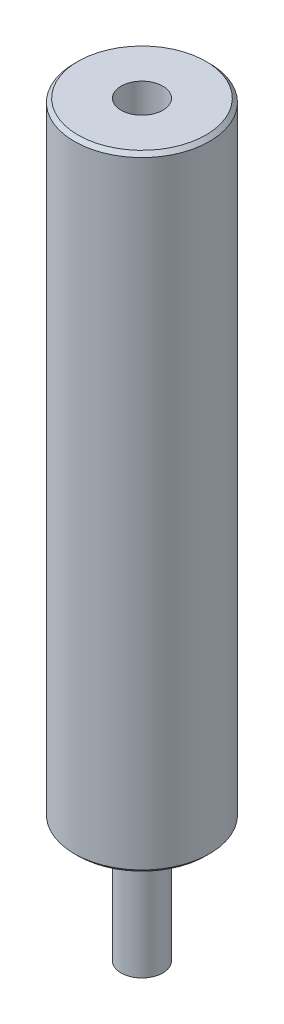
ISO-10303-21;
HEADER;
FILE_DESCRIPTION(('STEP AP214'),'2;1');
FILE_NAME('part.step','',(''),(''),'','','');
FILE_SCHEMA(('AUTOMOTIVE_DESIGN { 1 0 10303 214 1 1 1 1 }'));
ENDSEC;
DATA;
#1=APPLICATION_CONTEXT('core data for automotive mechanical design processes');
#2=APPLICATION_PROTOCOL_DEFINITION('international standard','automotive_design',2000,#1);
#3=PRODUCT_CONTEXT('',#1,'mechanical');
#4=PRODUCT('Part','Part','',(#3));
#5=PRODUCT_RELATED_PRODUCT_CATEGORY('part','',(#4));
#6=PRODUCT_DEFINITION_FORMATION('','',#4);
#7=PRODUCT_DEFINITION_CONTEXT('part definition',#1,'design');
#8=PRODUCT_DEFINITION('design','',#6,#7);
#9=PRODUCT_DEFINITION_SHAPE('','',#8);
#10=(LENGTH_UNIT() NAMED_UNIT(*) SI_UNIT(.MILLI.,.METRE.));
#11=(NAMED_UNIT(*) PLANE_ANGLE_UNIT() SI_UNIT($,.RADIAN.));
#12=(NAMED_UNIT(*) SI_UNIT($,.STERADIAN.) SOLID_ANGLE_UNIT());
#13=UNCERTAINTY_MEASURE_WITH_UNIT(LENGTH_MEASURE(1.E-05),#10,'distance_accuracy_value','');
#14=(GEOMETRIC_REPRESENTATION_CONTEXT(3) GLOBAL_UNCERTAINTY_ASSIGNED_CONTEXT((#13)) GLOBAL_UNIT_ASSIGNED_CONTEXT((#10,
#11,#12)) REPRESENTATION_CONTEXT('',''));
#15=CARTESIAN_POINT('',(0.,0.,0.));
#16=DIRECTION('',(0.,0.,1.));
#17=DIRECTION('',(1.,0.,0.));
#18=AXIS2_PLACEMENT_3D('',#15,#16,#17);
#19=CARTESIAN_POINT('',(-5.5896611928906E-12,-6.03498774064352E-11,0.));
#20=DIRECTION('',(0.,1.,0.));
#21=DIRECTION('',(0.,0.,1.));
#22=AXIS2_PLACEMENT_3D('',#19,#20,#21);
#23=CYLINDRICAL_SURFACE('',#22,1.7);
#24=CARTESIAN_POINT('',(-5.5896611928906E-12,-6.03498774064352E-11,0.));
#25=DIRECTION('',(0.,1.,0.));
#26=DIRECTION('',(0.,0.,1.));
#27=AXIS2_PLACEMENT_3D('',#24,#25,#26);
#28=CIRCLE('',#27,1.7);
#29=CARTESIAN_POINT('',(-5.5896611928906E-12,-6.03498774064352E-11,1.7));
#30=VERTEX_POINT('',#29);
#31=EDGE_CURVE('E62',#30,#30,#28,.T.);
#32=ORIENTED_EDGE('',*,*,#31,.T.);
#33=EDGE_LOOP('',(#32));
#34=FACE_BOUND('',#33,.T.);
#35=CARTESIAN_POINT('',(-5.5896611928906E-12,9.49999999993965,0.));
#36=DIRECTION('',(0.,1.,0.));
#37=DIRECTION('',(0.,0.,1.));
#38=AXIS2_PLACEMENT_3D('',#35,#36,#37);
#39=CIRCLE('',#38,1.7);
#40=CARTESIAN_POINT('',(-5.5896611928906E-12,9.49999999993965,1.7));
#41=VERTEX_POINT('',#40);
#42=EDGE_CURVE('E10',#41,#41,#39,.T.);
#43=ORIENTED_EDGE('',*,*,#42,.F.);
#44=EDGE_LOOP('',(#43));
#45=FACE_BOUND('',#44,.T.);
#46=ADVANCED_FACE('F31',(#34,#45),#23,.T.);
#47=CARTESIAN_POINT('',(-5.58971272046627E-12,9.49999999993965,0.));
#48=DIRECTION('',(0.,1.,0.));
#49=DIRECTION('',(0.,0.,1.));
#50=AXIS2_PLACEMENT_3D('',#47,#48,#49);
#51=TOROIDAL_SURFACE('',#50,2.2,0.500000000000001);
#52=ORIENTED_EDGE('',*,*,#42,.T.);
#53=EDGE_LOOP('',(#52));
#54=FACE_BOUND('',#53,.T.);
#55=CARTESIAN_POINT('',(-5.5896611928906E-12,9.99999999993965,0.));
#56=DIRECTION('',(0.,1.,0.));
#57=DIRECTION('',(0.,0.,1.));
#58=AXIS2_PLACEMENT_3D('',#55,#56,#57);
#59=CIRCLE('',#58,2.2);
#60=CARTESIAN_POINT('',(-5.5896611928906E-12,9.99999999993965,2.2));
#61=VERTEX_POINT('',#60);
#62=EDGE_CURVE('E37',#61,#61,#59,.T.);
#63=ORIENTED_EDGE('',*,*,#62,.F.);
#64=EDGE_LOOP('',(#63));
#65=FACE_BOUND('',#64,.T.);
#66=ADVANCED_FACE('F79',(#54,#65),#51,.F.);
#67=CARTESIAN_POINT('',(5.19999999993965,9.99999999993965,0.));
#68=DIRECTION('',(0.,-1.,0.));
#69=DIRECTION('',(0.,0.,-1.));
#70=AXIS2_PLACEMENT_3D('',#67,#68,#69);
#71=PLANE('',#70);
#72=ORIENTED_EDGE('',*,*,#62,.T.);
#73=EDGE_LOOP('',(#72));
#74=FACE_BOUND('',#73,.T.);
#75=CARTESIAN_POINT('',(-5.5896611928906E-12,9.99999999993965,0.));
#76=DIRECTION('',(0.,1.,0.));
#77=DIRECTION('',(0.,0.,1.));
#78=AXIS2_PLACEMENT_3D('',#75,#76,#77);
#79=CIRCLE('',#78,5.19999999994524);
#80=CARTESIAN_POINT('',(-5.5896611928906E-12,9.99999999993965,5.19999999994524));
#81=VERTEX_POINT('',#80);
#82=EDGE_CURVE('E41',#81,#81,#79,.T.);
#83=ORIENTED_EDGE('',*,*,#82,.F.);
#84=EDGE_LOOP('',(#83));
#85=FACE_BOUND('',#84,.T.);
#86=ADVANCED_FACE('F83',(#74,#85),#71,.T.);
#87=CARTESIAN_POINT('',(-5.5896611928906E-12,10.3,0.));
#88=DIRECTION('',(0.,1.,0.));
#89=DIRECTION('',(0.,0.,1.));
#90=AXIS2_PLACEMENT_3D('',#87,#88,#89);
#91=CONICAL_SURFACE('',#90,5.50000000000559,0.785398163397448);
#92=ORIENTED_EDGE('',*,*,#82,.T.);
#93=EDGE_LOOP('',(#92));
#94=FACE_BOUND('',#93,.T.);
#95=CARTESIAN_POINT('',(-5.5896611928906E-12,10.3,0.));
#96=DIRECTION('',(0.,1.,0.));
#97=DIRECTION('',(0.,0.,1.));
#98=AXIS2_PLACEMENT_3D('',#95,#96,#97);
#99=CIRCLE('',#98,5.50000000000559);
#100=CARTESIAN_POINT('',(-5.5896611928906E-12,10.3,5.50000000000559));
#101=VERTEX_POINT('',#100);
#102=EDGE_CURVE('E45',#101,#101,#99,.T.);
#103=ORIENTED_EDGE('',*,*,#102,.F.);
#104=EDGE_LOOP('',(#103));
#105=FACE_BOUND('',#104,.T.);
#106=ADVANCED_FACE('F87',(#94,#105),#91,.T.);
#107=CARTESIAN_POINT('',(-5.5896611928906E-12,-6.03498774064352E-11,0.));
#108=DIRECTION('',(0.,1.,0.));
#109=DIRECTION('',(0.,0.,1.));
#110=AXIS2_PLACEMENT_3D('',#107,#108,#109);
#111=CYLINDRICAL_SURFACE('',#110,5.50000000000559);
#112=ORIENTED_EDGE('',*,*,#102,.T.);
#113=EDGE_LOOP('',(#112));
#114=FACE_BOUND('',#113,.T.);
#115=CARTESIAN_POINT('',(-5.5896611928906E-12,60.5,0.));
#116=DIRECTION('',(0.,1.,0.));
#117=DIRECTION('',(0.,0.,1.));
#118=AXIS2_PLACEMENT_3D('',#115,#116,#117);
#119=CIRCLE('',#118,5.50000000000559);
#120=CARTESIAN_POINT('',(-5.5896611928906E-12,60.5,5.50000000000559));
#121=VERTEX_POINT('',#120);
#122=EDGE_CURVE('E50',#121,#121,#119,.T.);
#123=ORIENTED_EDGE('',*,*,#122,.F.);
#124=EDGE_LOOP('',(#123));
#125=FACE_BOUND('',#124,.T.);
#126=ADVANCED_FACE('F93',(#114,#125),#111,.T.);
#127=CARTESIAN_POINT('',(-5.5896611928906E-12,60.8000000000418,0.));
#128=DIRECTION('',(0.,-1.,0.));
#129=DIRECTION('',(0.,0.,-1.));
#130=AXIS2_PLACEMENT_3D('',#127,#128,#129);
#131=CONICAL_SURFACE('',#130,5.19999999996379,0.785398163397441);
#132=ORIENTED_EDGE('',*,*,#122,.T.);
#133=EDGE_LOOP('',(#132));
#134=FACE_BOUND('',#133,.T.);
#135=CARTESIAN_POINT('',(-5.5896611928906E-12,60.8000000000418,0.));
#136=DIRECTION('',(0.,1.,0.));
#137=DIRECTION('',(0.,0.,1.));
#138=AXIS2_PLACEMENT_3D('',#135,#136,#137);
#139=CIRCLE('',#138,5.19999999996379);
#140=CARTESIAN_POINT('',(-5.5896611928906E-12,60.8000000000418,5.19999999996379));
#141=VERTEX_POINT('',#140);
#142=EDGE_CURVE('E53',#141,#141,#139,.T.);
#143=ORIENTED_EDGE('',*,*,#142,.F.);
#144=EDGE_LOOP('',(#143));
#145=FACE_BOUND('',#144,.T.);
#146=ADVANCED_FACE('F97',(#134,#145),#131,.T.);
#147=CARTESIAN_POINT('',(1.69999999999442,60.8000000000418,0.));
#148=DIRECTION('',(0.,1.,0.));
#149=DIRECTION('',(0.,0.,1.));
#150=AXIS2_PLACEMENT_3D('',#147,#148,#149);
#151=PLANE('',#150);
#152=ORIENTED_EDGE('',*,*,#142,.T.);
#153=EDGE_LOOP('',(#152));
#154=FACE_BOUND('',#153,.T.);
#155=CARTESIAN_POINT('',(-5.5896611928906E-12,60.8000000000418,0.));
#156=DIRECTION('',(0.,1.,0.));
#157=DIRECTION('',(0.,0.,1.));
#158=AXIS2_PLACEMENT_3D('',#155,#156,#157);
#159=CIRCLE('',#158,1.70000000000001);
#160=CARTESIAN_POINT('',(-5.5896611928906E-12,60.8000000000418,1.70000000000001));
#161=VERTEX_POINT('',#160);
#162=EDGE_CURVE('E56',#161,#161,#159,.T.);
#163=ORIENTED_EDGE('',*,*,#162,.F.);
#164=EDGE_LOOP('',(#163));
#165=FACE_BOUND('',#164,.T.);
#166=ADVANCED_FACE('F101',(#154,#165),#151,.T.);
#167=CARTESIAN_POINT('',(-5.5896611928906E-12,-6.03498774064352E-11,0.));
#168=DIRECTION('',(0.,1.,0.));
#169=DIRECTION('',(0.,0.,1.));
#170=AXIS2_PLACEMENT_3D('',#167,#168,#169);
#171=CYLINDRICAL_SURFACE('',#170,1.70000000000001);
#172=ORIENTED_EDGE('',*,*,#162,.T.);
#173=EDGE_LOOP('',(#172));
#174=FACE_BOUND('',#173,.T.);
#175=CARTESIAN_POINT('',(-5.5896611928906E-12,50.7999999999397,0.));
#176=DIRECTION('',(0.,1.,0.));
#177=DIRECTION('',(0.,0.,1.));
#178=AXIS2_PLACEMENT_3D('',#175,#176,#177);
#179=CIRCLE('',#178,1.70000000000001);
#180=CARTESIAN_POINT('',(-5.5896611928906E-12,50.7999999999397,1.70000000000001));
#181=VERTEX_POINT('',#180);
#182=EDGE_CURVE('E59',#181,#181,#179,.T.);
#183=ORIENTED_EDGE('',*,*,#182,.F.);
#184=EDGE_LOOP('',(#183));
#185=FACE_BOUND('',#184,.T.);
#186=ADVANCED_FACE('F75',(#174,#185),#171,.F.);
#187=CARTESIAN_POINT('',(-5.5896611928906E-12,50.7999999999397,0.));
#188=DIRECTION('',(0.,1.,0.));
#189=DIRECTION('',(0.,0.,1.));
#190=AXIS2_PLACEMENT_3D('',#187,#188,#189);
#191=PLANE('',#190);
#192=ORIENTED_EDGE('',*,*,#182,.T.);
#193=EDGE_LOOP('',(#192));
#194=FACE_BOUND('',#193,.T.);
#195=ADVANCED_FACE('F70',(#194),#191,.T.);
#196=CARTESIAN_POINT('',(1.69999999999441,-6.03498774064352E-11,0.));
#197=DIRECTION('',(0.,-1.,0.));
#198=DIRECTION('',(0.,0.,-1.));
#199=AXIS2_PLACEMENT_3D('',#196,#197,#198);
#200=PLANE('',#199);
#201=ORIENTED_EDGE('',*,*,#31,.F.);
#202=EDGE_LOOP('',(#201));
#203=FACE_BOUND('',#202,.T.);
#204=ADVANCED_FACE('F68',(#203),#200,.T.);
#205=CLOSED_SHELL('',(#46,#66,#86,#106,#126,#146,#166,#186,#195,#204));
#206=MANIFOLD_SOLID_BREP('B2',#205);
#207=ADVANCED_BREP_SHAPE_REPRESENTATION('',(#18,#206),#14);
#208=SHAPE_DEFINITION_REPRESENTATION(#9,#207);
ENDSEC;
END-ISO-10303-21;
